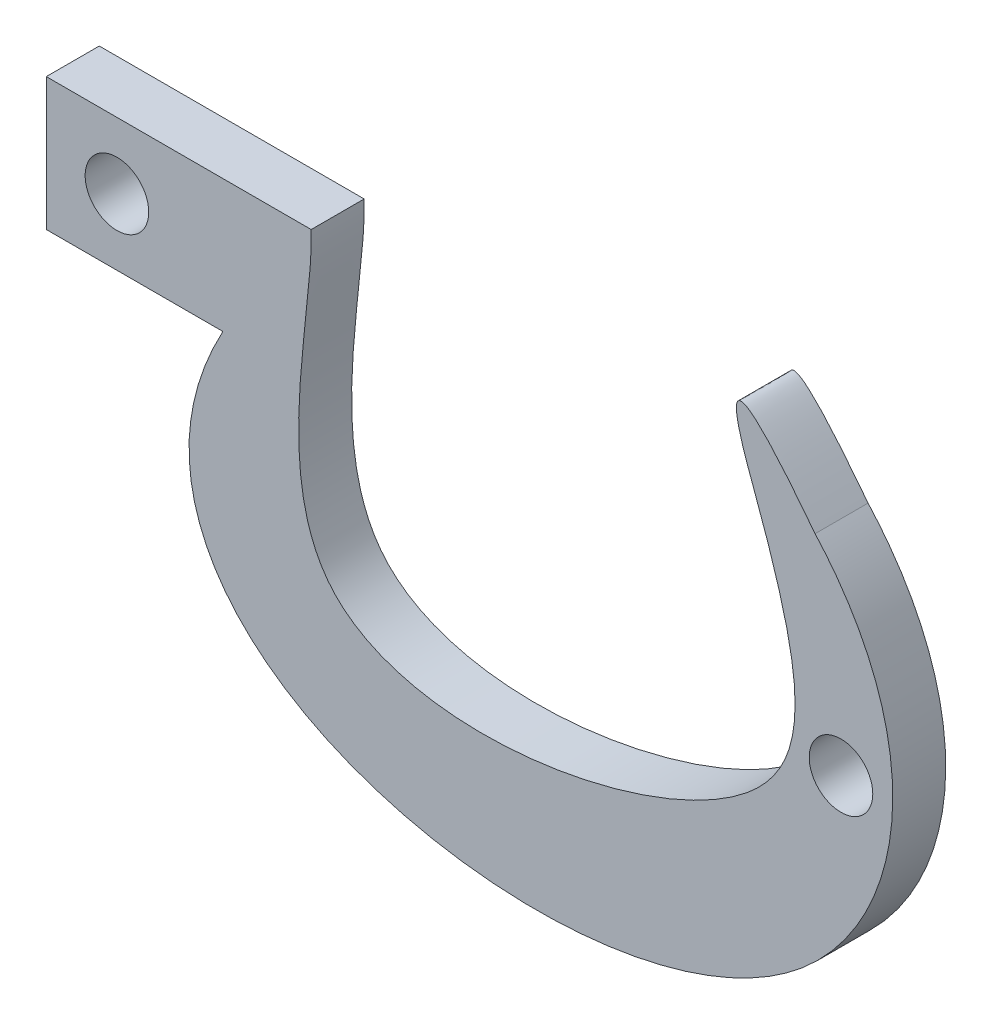
ISO-10303-21;
HEADER;
FILE_DESCRIPTION(('STEP AP214'),'2;1');
FILE_NAME('part.step','',(''),(''),'','','');
FILE_SCHEMA(('AUTOMOTIVE_DESIGN { 1 0 10303 214 1 1 1 1 }'));
ENDSEC;
DATA;
#1=APPLICATION_CONTEXT('core data for automotive mechanical design processes');
#2=APPLICATION_PROTOCOL_DEFINITION('international standard','automotive_design',2000,#1);
#3=PRODUCT_CONTEXT('',#1,'mechanical');
#4=PRODUCT('Part','Part','',(#3));
#5=PRODUCT_RELATED_PRODUCT_CATEGORY('part','',(#4));
#6=PRODUCT_DEFINITION_FORMATION('','',#4);
#7=PRODUCT_DEFINITION_CONTEXT('part definition',#1,'design');
#8=PRODUCT_DEFINITION('design','',#6,#7);
#9=PRODUCT_DEFINITION_SHAPE('','',#8);
#10=(LENGTH_UNIT() NAMED_UNIT(*) SI_UNIT(.MILLI.,.METRE.));
#11=(NAMED_UNIT(*) PLANE_ANGLE_UNIT() SI_UNIT($,.RADIAN.));
#12=(NAMED_UNIT(*) SI_UNIT($,.STERADIAN.) SOLID_ANGLE_UNIT());
#13=UNCERTAINTY_MEASURE_WITH_UNIT(LENGTH_MEASURE(1.E-05),#10,'distance_accuracy_value','');
#14=(GEOMETRIC_REPRESENTATION_CONTEXT(3) GLOBAL_UNCERTAINTY_ASSIGNED_CONTEXT((#13)) GLOBAL_UNIT_ASSIGNED_CONTEXT((#10,
#11,#12)) REPRESENTATION_CONTEXT('',''));
#15=CARTESIAN_POINT('',(0.,0.,0.));
#16=DIRECTION('',(0.,0.,1.));
#17=DIRECTION('',(1.,0.,0.));
#18=AXIS2_PLACEMENT_3D('',#15,#16,#17);
#19=CARTESIAN_POINT('',(22.2772197852829,-15.6675134234376,3.));
#20=DIRECTION('',(0.,0.,-1.));
#21=DIRECTION('',(-1.,0.,0.));
#22=AXIS2_PLACEMENT_3D('',#19,#20,#21);
#23=PLANE('',#22);
#24=DIRECTION('',(0.,-1.,0.));
#25=VECTOR('',#24,1.);
#26=CARTESIAN_POINT('',(-9.14533008067706,11.1117199122807,3.));
#27=LINE('',#26,#25);
#28=CARTESIAN_POINT('',(-9.14533008067706,11.1117199122807,3.));
#29=VERTEX_POINT('',#28);
#30=CARTESIAN_POINT('',(-9.14533008067706,3.61171991228071,3.));
#31=VERTEX_POINT('',#30);
#32=EDGE_CURVE('E154',#29,#31,#27,.T.);
#33=ORIENTED_EDGE('',*,*,#32,.T.);
#34=DIRECTION('',(1.,0.,0.));
#35=VECTOR('',#34,1.);
#36=CARTESIAN_POINT('',(-9.14533008067706,3.61171991228071,3.));
#37=LINE('',#36,#35);
#38=CARTESIAN_POINT('',(0.854669919322935,3.61171991228071,3.));
#39=VERTEX_POINT('',#38);
#40=EDGE_CURVE('E91',#31,#39,#37,.T.);
#41=ORIENTED_EDGE('',*,*,#40,.T.);
#42=CARTESIAN_POINT('',(0.854669919322935,3.61171991228071,3.));
#43=CARTESIAN_POINT('',(-8.90464188257023,-14.3922773126079,3.));
#44=CARTESIAN_POINT('',(36.8051788589955,-24.6458274744094,3.));
#45=CARTESIAN_POINT('',(41.1049825537956,3.016776947175,3.));
#46=CARTESIAN_POINT('',(34.3894415169519,10.4632061306261,3.));
#47=B_SPLINE_CURVE_WITH_KNOTS('',3,(#42,#43,#44,#45,#46),.UNSPECIFIED.,.F.,.F.,(4,1,4),(0.,
0.657630445853048,1.),.UNSPECIFIED.);
#48=CARTESIAN_POINT('',(34.3894415169519,10.4632061306261,3.));
#49=VERTEX_POINT('',#48);
#50=EDGE_CURVE('E105',#39,#49,#47,.T.);
#51=ORIENTED_EDGE('',*,*,#50,.T.);
#52=CARTESIAN_POINT('',(34.3894415169519,10.4632061306261,3.));
#53=CARTESIAN_POINT('',(27.9016182098447,18.9314918286941,3.));
#54=CARTESIAN_POINT('',(30.8546699193229,11.1117199122807,3.));
#55=B_SPLINE_CURVE_WITH_KNOTS('',2,(#52,#53,#54),.UNSPECIFIED.,.F.,.F.,(3,3),(0.,1.),.UNSPECIFIED.);
#56=CARTESIAN_POINT('',(30.8546699193229,11.1117199122808,3.));
#57=VERTEX_POINT('',#56);
#58=EDGE_CURVE('E98',#49,#57,#55,.T.);
#59=ORIENTED_EDGE('',*,*,#58,.T.);
#60=CARTESIAN_POINT('',(30.8546699193229,11.1117199122808,3.));
#61=CARTESIAN_POINT('',(33.778825154944,3.24043310835155,3.));
#62=CARTESIAN_POINT('',(35.1332105673086,-6.83799380966936,3.));
#63=CARTESIAN_POINT('',(0.382726488243162,-13.0577601879293,3.));
#64=CARTESIAN_POINT('',(6.00173327724752,6.88832948579028,3.));
#65=CARTESIAN_POINT('',(5.85466991932293,11.1117199122807,3.));
#66=B_SPLINE_CURVE_WITH_KNOTS('',3,(#60,#61,#62,#63,#64,#65),.UNSPECIFIED.,.F.,.F.,(4,1,1,4),
(0.,0.272727272727273,0.681818181818182,1.),.UNSPECIFIED.);
#67=CARTESIAN_POINT('',(5.85466991932293,11.1117199122807,3.));
#68=VERTEX_POINT('',#67);
#69=EDGE_CURVE('E102',#57,#68,#66,.T.);
#70=ORIENTED_EDGE('',*,*,#69,.T.);
#71=DIRECTION('',(-1.,0.,0.));
#72=VECTOR('',#71,1.);
#73=CARTESIAN_POINT('',(0.854669919322938,11.1117199122807,3.));
#74=LINE('',#73,#72);
#75=EDGE_CURVE('E56',#68,#29,#74,.T.);
#76=ORIENTED_EDGE('',*,*,#75,.T.);
#77=EDGE_LOOP('',(#33,#41,#51,#59,#70,#76));
#78=FACE_BOUND('',#77,.T.);
#79=CARTESIAN_POINT('',(-5.14533008067706,7.36171991228071,3.));
#80=DIRECTION('',(0.,0.,1.));
#81=DIRECTION('',(1.,0.,0.));
#82=AXIS2_PLACEMENT_3D('',#79,#80,#81);
#83=CIRCLE('',#82,1.8);
#84=CARTESIAN_POINT('',(-3.34533008067706,7.36171991228071,3.));
#85=VERTEX_POINT('',#84);
#86=EDGE_CURVE('E159',#85,#85,#83,.T.);
#87=ORIENTED_EDGE('',*,*,#86,.F.);
#88=EDGE_LOOP('',(#87));
#89=FACE_BOUND('',#88,.T.);
#90=CARTESIAN_POINT('',(35.8546699193229,-0.669005570349684,3.));
#91=DIRECTION('',(0.,0.,1.));
#92=DIRECTION('',(1.,0.,0.));
#93=AXIS2_PLACEMENT_3D('',#90,#91,#92);
#94=CIRCLE('',#93,1.8);
#95=CARTESIAN_POINT('',(37.6546699193229,-0.669005570349684,3.));
#96=VERTEX_POINT('',#95);
#97=EDGE_CURVE('E160',#96,#96,#94,.T.);
#98=ORIENTED_EDGE('',*,*,#97,.F.);
#99=EDGE_LOOP('',(#98));
#100=FACE_BOUND('',#99,.T.);
#101=ADVANCED_FACE('F39',(#78,#89,#100),#23,.F.);
#102=CARTESIAN_POINT('',(22.2772197852829,-15.6675134234376,0.));
#103=DIRECTION('',(0.,0.,-1.));
#104=DIRECTION('',(-1.,0.,0.));
#105=AXIS2_PLACEMENT_3D('',#102,#103,#104);
#106=PLANE('',#105);
#107=CARTESIAN_POINT('',(-5.14533008067706,7.36171991228071,0.));
#108=DIRECTION('',(0.,0.,1.));
#109=DIRECTION('',(1.,0.,0.));
#110=AXIS2_PLACEMENT_3D('',#107,#108,#109);
#111=CIRCLE('',#110,1.8);
#112=CARTESIAN_POINT('',(-3.34533008067706,7.36171991228071,0.));
#113=VERTEX_POINT('',#112);
#114=EDGE_CURVE('E156',#113,#113,#111,.T.);
#115=ORIENTED_EDGE('',*,*,#114,.T.);
#116=EDGE_LOOP('',(#115));
#117=FACE_BOUND('',#116,.T.);
#118=DIRECTION('',(0.,-1.,0.));
#119=VECTOR('',#118,1.);
#120=CARTESIAN_POINT('',(-9.14533008067706,11.1117199122807,0.));
#121=LINE('',#120,#119);
#122=CARTESIAN_POINT('',(-9.14533008067706,11.1117199122807,0.));
#123=VERTEX_POINT('',#122);
#124=CARTESIAN_POINT('',(-9.14533008067706,3.61171991228071,0.));
#125=VERTEX_POINT('',#124);
#126=EDGE_CURVE('E163',#123,#125,#121,.T.);
#127=ORIENTED_EDGE('',*,*,#126,.F.);
#128=DIRECTION('',(-1.,0.,0.));
#129=VECTOR('',#128,1.);
#130=CARTESIAN_POINT('',(-9.14533008067706,11.1117199122807,0.));
#131=LINE('',#130,#129);
#132=CARTESIAN_POINT('',(5.85466991932293,11.1117199122807,0.));
#133=VERTEX_POINT('',#132);
#134=EDGE_CURVE('E79',#133,#123,#131,.T.);
#135=ORIENTED_EDGE('',*,*,#134,.F.);
#136=CARTESIAN_POINT('',(30.8546699193229,11.1117199122808,0.));
#137=CARTESIAN_POINT('',(33.778825154944,3.24043310835155,0.));
#138=CARTESIAN_POINT('',(35.1332105673086,-6.83799380966936,0.));
#139=CARTESIAN_POINT('',(0.382726488243162,-13.0577601879293,0.));
#140=CARTESIAN_POINT('',(6.00173327724752,6.88832948579028,0.));
#141=CARTESIAN_POINT('',(5.85466991932293,11.1117199122807,0.));
#142=B_SPLINE_CURVE_WITH_KNOTS('',3,(#136,#137,#138,#139,#140,#141),.UNSPECIFIED.,.F.,.F.,(4,1,
1,4),(0.,0.272727272727273,0.681818181818182,1.),.UNSPECIFIED.);
#143=CARTESIAN_POINT('',(30.8546699193229,11.1117199122808,0.));
#144=VERTEX_POINT('',#143);
#145=EDGE_CURVE('E267',#144,#133,#142,.T.);
#146=ORIENTED_EDGE('',*,*,#145,.F.);
#147=CARTESIAN_POINT('',(34.3894415169519,10.4632061306261,0.));
#148=CARTESIAN_POINT('',(27.9016182098447,18.9314918286941,0.));
#149=CARTESIAN_POINT('',(30.8546699193229,11.1117199122807,0.));
#150=B_SPLINE_CURVE_WITH_KNOTS('',2,(#147,#148,#149),.UNSPECIFIED.,.F.,.F.,(3,3),(0.,1.),.UNSPECIFIED.);
#151=CARTESIAN_POINT('',(34.3894415169519,10.4632061306261,0.));
#152=VERTEX_POINT('',#151);
#153=EDGE_CURVE('E114',#152,#144,#150,.T.);
#154=ORIENTED_EDGE('',*,*,#153,.F.);
#155=CARTESIAN_POINT('',(0.854669919322935,3.61171991228071,0.));
#156=CARTESIAN_POINT('',(-8.90464188257023,-14.3922773126079,0.));
#157=CARTESIAN_POINT('',(36.8051788589955,-24.6458274744094,0.));
#158=CARTESIAN_POINT('',(41.1049825537956,3.016776947175,0.));
#159=CARTESIAN_POINT('',(34.3894415169519,10.4632061306261,0.));
#160=B_SPLINE_CURVE_WITH_KNOTS('',3,(#155,#156,#157,#158,#159),.UNSPECIFIED.,.F.,.F.,(4,1,4),
(0.,0.657630445853048,1.),.UNSPECIFIED.);
#161=CARTESIAN_POINT('',(0.854669919322935,3.61171991228071,0.));
#162=VERTEX_POINT('',#161);
#163=EDGE_CURVE('E255',#162,#152,#160,.T.);
#164=ORIENTED_EDGE('',*,*,#163,.F.);
#165=DIRECTION('',(1.,0.,0.));
#166=VECTOR('',#165,1.);
#167=CARTESIAN_POINT('',(-9.14533008067706,3.61171991228071,0.));
#168=LINE('',#167,#166);
#169=EDGE_CURVE('E254',#125,#162,#168,.T.);
#170=ORIENTED_EDGE('',*,*,#169,.F.);
#171=EDGE_LOOP('',(#127,#135,#146,#154,#164,#170));
#172=FACE_BOUND('',#171,.T.);
#173=CARTESIAN_POINT('',(35.8546699193229,-0.669005570349684,0.));
#174=DIRECTION('',(0.,0.,1.));
#175=DIRECTION('',(1.,0.,0.));
#176=AXIS2_PLACEMENT_3D('',#173,#174,#175);
#177=CIRCLE('',#176,1.8);
#178=CARTESIAN_POINT('',(37.6546699193229,-0.669005570349684,0.));
#179=VERTEX_POINT('',#178);
#180=EDGE_CURVE('E164',#179,#179,#177,.T.);
#181=ORIENTED_EDGE('',*,*,#180,.T.);
#182=EDGE_LOOP('',(#181));
#183=FACE_BOUND('',#182,.T.);
#184=ADVANCED_FACE('F174',(#117,#172,#183),#106,.T.);
#185=CARTESIAN_POINT('',(-9.14533008067706,11.1117199122807,3.));
#186=DIRECTION('',(1.,0.,0.));
#187=DIRECTION('',(0.,1.,0.));
#188=AXIS2_PLACEMENT_3D('',#185,#186,#187);
#189=PLANE('',#188);
#190=ORIENTED_EDGE('',*,*,#126,.T.);
#191=DIRECTION('',(0.,0.,-1.));
#192=VECTOR('',#191,1.);
#193=CARTESIAN_POINT('',(-9.14533008067706,3.61171991228071,3.));
#194=LINE('',#193,#192);
#195=EDGE_CURVE('E11',#31,#125,#194,.T.);
#196=ORIENTED_EDGE('',*,*,#195,.F.);
#197=ORIENTED_EDGE('',*,*,#32,.F.);
#198=DIRECTION('',(0.,0.,-1.));
#199=VECTOR('',#198,1.);
#200=CARTESIAN_POINT('',(-9.14533008067706,11.1117199122807,3.));
#201=LINE('',#200,#199);
#202=EDGE_CURVE('E121',#29,#123,#201,.T.);
#203=ORIENTED_EDGE('',*,*,#202,.T.);
#204=EDGE_LOOP('',(#190,#196,#197,#203));
#205=FACE_BOUND('',#204,.T.);
#206=ADVANCED_FACE('F41',(#205),#189,.F.);
#207=CARTESIAN_POINT('',(-9.14533008067706,3.61171991228071,3.));
#208=DIRECTION('',(0.,1.,0.));
#209=DIRECTION('',(0.,0.,1.));
#210=AXIS2_PLACEMENT_3D('',#207,#208,#209);
#211=PLANE('',#210);
#212=ORIENTED_EDGE('',*,*,#169,.T.);
#213=DIRECTION('',(0.,0.,-1.));
#214=VECTOR('',#213,1.);
#215=CARTESIAN_POINT('',(0.854669919322935,3.61171991228071,3.));
#216=LINE('',#215,#214);
#217=EDGE_CURVE('E48',#39,#162,#216,.T.);
#218=ORIENTED_EDGE('',*,*,#217,.F.);
#219=ORIENTED_EDGE('',*,*,#40,.F.);
#220=ORIENTED_EDGE('',*,*,#195,.T.);
#221=EDGE_LOOP('',(#212,#218,#219,#220));
#222=FACE_BOUND('',#221,.T.);
#223=ADVANCED_FACE('F144',(#222),#211,.F.);
#224=DIRECTION('',(0.,0.,-1.));
#225=VECTOR('',#224,1.);
#226=SURFACE_OF_LINEAR_EXTRUSION('',#47,#225);
#227=ORIENTED_EDGE('',*,*,#163,.T.);
#228=DIRECTION('',(0.,0.,-1.));
#229=VECTOR('',#228,1.);
#230=CARTESIAN_POINT('',(34.3894415169519,10.4632061306261,3.));
#231=LINE('',#230,#229);
#232=EDGE_CURVE('E116',#49,#152,#231,.T.);
#233=ORIENTED_EDGE('',*,*,#232,.F.);
#234=ORIENTED_EDGE('',*,*,#50,.F.);
#235=ORIENTED_EDGE('',*,*,#217,.T.);
#236=EDGE_LOOP('',(#227,#233,#234,#235));
#237=FACE_BOUND('',#236,.T.);
#238=ADVANCED_FACE('F142',(#237),#226,.F.);
#239=DIRECTION('',(0.,0.,-1.));
#240=VECTOR('',#239,1.);
#241=SURFACE_OF_LINEAR_EXTRUSION('',#55,#240);
#242=ORIENTED_EDGE('',*,*,#153,.T.);
#243=DIRECTION('',(0.,0.,-1.));
#244=VECTOR('',#243,1.);
#245=CARTESIAN_POINT('',(30.8546699193229,11.1117199122808,3.));
#246=LINE('',#245,#244);
#247=EDGE_CURVE('E111',#57,#144,#246,.T.);
#248=ORIENTED_EDGE('',*,*,#247,.F.);
#249=ORIENTED_EDGE('',*,*,#58,.F.);
#250=ORIENTED_EDGE('',*,*,#232,.T.);
#251=EDGE_LOOP('',(#242,#248,#249,#250));
#252=FACE_BOUND('',#251,.T.);
#253=ADVANCED_FACE('F112',(#252),#241,.F.);
#254=DIRECTION('',(0.,0.,-1.));
#255=VECTOR('',#254,1.);
#256=SURFACE_OF_LINEAR_EXTRUSION('',#66,#255);
#257=ORIENTED_EDGE('',*,*,#145,.T.);
#258=DIRECTION('',(0.,0.,-1.));
#259=VECTOR('',#258,1.);
#260=CARTESIAN_POINT('',(5.85466991932293,11.1117199122807,3.));
#261=LINE('',#260,#259);
#262=EDGE_CURVE('E117',#68,#133,#261,.T.);
#263=ORIENTED_EDGE('',*,*,#262,.F.);
#264=ORIENTED_EDGE('',*,*,#69,.F.);
#265=ORIENTED_EDGE('',*,*,#247,.T.);
#266=EDGE_LOOP('',(#257,#263,#264,#265));
#267=FACE_BOUND('',#266,.T.);
#268=ADVANCED_FACE('F119',(#267),#256,.F.);
#269=CARTESIAN_POINT('',(-9.14533008067706,11.1117199122807,3.));
#270=DIRECTION('',(0.,-1.,0.));
#271=DIRECTION('',(0.,0.,-1.));
#272=AXIS2_PLACEMENT_3D('',#269,#270,#271);
#273=PLANE('',#272);
#274=ORIENTED_EDGE('',*,*,#134,.T.);
#275=ORIENTED_EDGE('',*,*,#202,.F.);
#276=ORIENTED_EDGE('',*,*,#75,.F.);
#277=ORIENTED_EDGE('',*,*,#262,.T.);
#278=EDGE_LOOP('',(#274,#275,#276,#277));
#279=FACE_BOUND('',#278,.T.);
#280=ADVANCED_FACE('F138',(#279),#273,.F.);
#281=CARTESIAN_POINT('',(-5.14533008067706,7.36171991228071,3.));
#282=DIRECTION('',(0.,0.,-1.));
#283=DIRECTION('',(-1.,0.,0.));
#284=AXIS2_PLACEMENT_3D('',#281,#282,#283);
#285=CYLINDRICAL_SURFACE('',#284,1.8);
#286=ORIENTED_EDGE('',*,*,#86,.T.);
#287=EDGE_LOOP('',(#286));
#288=FACE_BOUND('',#287,.T.);
#289=ORIENTED_EDGE('',*,*,#114,.F.);
#290=EDGE_LOOP('',(#289));
#291=FACE_BOUND('',#290,.T.);
#292=ADVANCED_FACE('F181',(#288,#291),#285,.F.);
#293=CARTESIAN_POINT('',(35.8546699193229,-0.669005570349684,3.));
#294=DIRECTION('',(0.,0.,-1.));
#295=DIRECTION('',(-1.,0.,0.));
#296=AXIS2_PLACEMENT_3D('',#293,#294,#295);
#297=CYLINDRICAL_SURFACE('',#296,1.8);
#298=ORIENTED_EDGE('',*,*,#97,.T.);
#299=EDGE_LOOP('',(#298));
#300=FACE_BOUND('',#299,.T.);
#301=ORIENTED_EDGE('',*,*,#180,.F.);
#302=EDGE_LOOP('',(#301));
#303=FACE_BOUND('',#302,.T.);
#304=ADVANCED_FACE('F170',(#300,#303),#297,.F.);
#305=CLOSED_SHELL('',(#101,#184,#206,#223,#238,#253,#268,#280,#292,#304));
#306=MANIFOLD_SOLID_BREP('B2',#305);
#307=ADVANCED_BREP_SHAPE_REPRESENTATION('',(#18,#306),#14);
#308=SHAPE_DEFINITION_REPRESENTATION(#9,#307);
ENDSEC;
END-ISO-10303-21;
